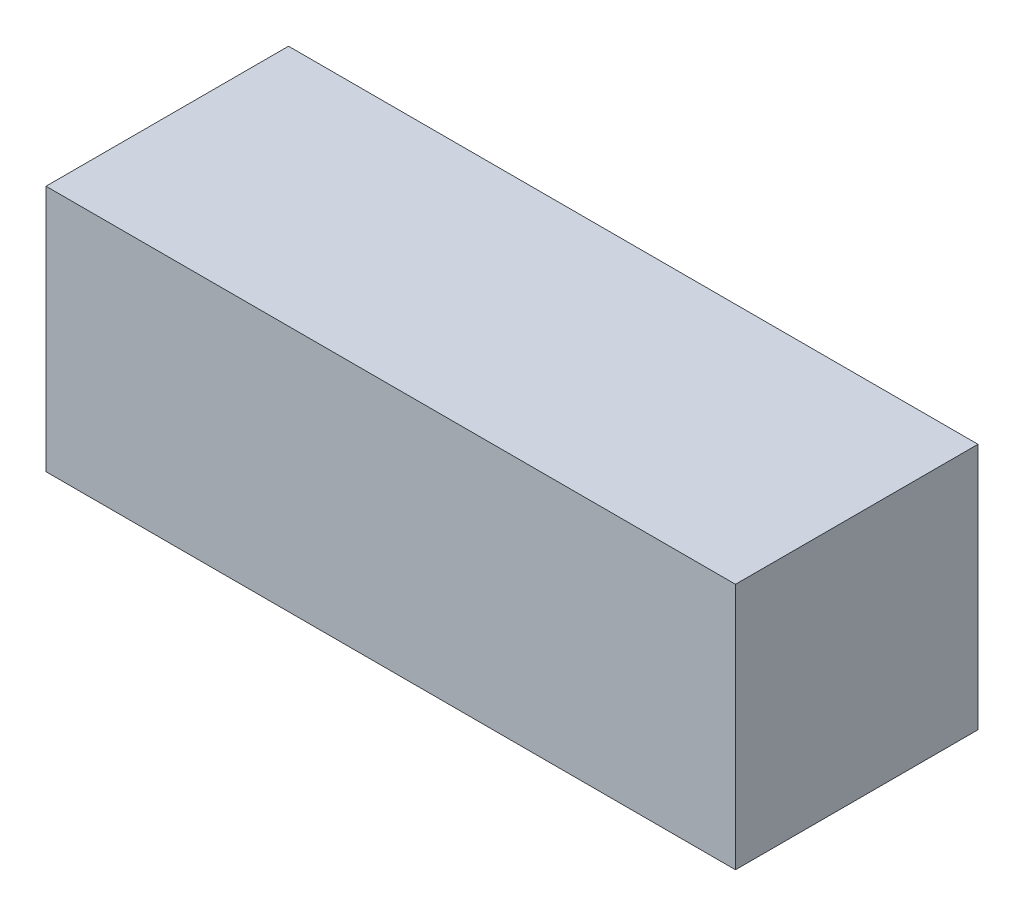
ISO-10303-21;
HEADER;
FILE_DESCRIPTION(('STEP AP214'),'2;1');
FILE_NAME('part.step','',(''),(''),'','','');
FILE_SCHEMA(('AUTOMOTIVE_DESIGN { 1 0 10303 214 1 1 1 1 }'));
ENDSEC;
DATA;
#1=APPLICATION_CONTEXT('core data for automotive mechanical design processes');
#2=APPLICATION_PROTOCOL_DEFINITION('international standard','automotive_design',2000,#1);
#3=PRODUCT_CONTEXT('',#1,'mechanical');
#4=PRODUCT('Part','Part','',(#3));
#5=PRODUCT_RELATED_PRODUCT_CATEGORY('part','',(#4));
#6=PRODUCT_DEFINITION_FORMATION('','',#4);
#7=PRODUCT_DEFINITION_CONTEXT('part definition',#1,'design');
#8=PRODUCT_DEFINITION('design','',#6,#7);
#9=PRODUCT_DEFINITION_SHAPE('','',#8);
#10=(LENGTH_UNIT() NAMED_UNIT(*) SI_UNIT(.MILLI.,.METRE.));
#11=(NAMED_UNIT(*) PLANE_ANGLE_UNIT() SI_UNIT($,.RADIAN.));
#12=(NAMED_UNIT(*) SI_UNIT($,.STERADIAN.) SOLID_ANGLE_UNIT());
#13=UNCERTAINTY_MEASURE_WITH_UNIT(LENGTH_MEASURE(1.E-05),#10,'distance_accuracy_value','');
#14=(GEOMETRIC_REPRESENTATION_CONTEXT(3) GLOBAL_UNCERTAINTY_ASSIGNED_CONTEXT((#13)) GLOBAL_UNIT_ASSIGNED_CONTEXT((#10,
#11,#12)) REPRESENTATION_CONTEXT('',''));
#15=CARTESIAN_POINT('',(0.,0.,0.));
#16=DIRECTION('',(0.,0.,1.));
#17=DIRECTION('',(1.,0.,0.));
#18=AXIS2_PLACEMENT_3D('',#15,#16,#17);
#19=CARTESIAN_POINT('',(72.499982,51.999896,-25.499949));
#20=DIRECTION('',(-1.,0.,0.));
#21=DIRECTION('',(0.,0.,1.));
#22=AXIS2_PLACEMENT_3D('',#19,#20,#21);
#23=PLANE('',#22);
#24=DIRECTION('',(0.,0.,-1.));
#25=VECTOR('',#24,1.);
#26=CARTESIAN_POINT('',(72.499982,0.,-25.499949));
#27=LINE('',#26,#25);
#28=CARTESIAN_POINT('',(72.499982,0.,25.499949));
#29=VERTEX_POINT('',#28);
#30=CARTESIAN_POINT('',(72.499982,0.,-25.499949));
#31=VERTEX_POINT('',#30);
#32=EDGE_CURVE('E99',#29,#31,#27,.T.);
#33=ORIENTED_EDGE('',*,*,#32,.T.);
#34=DIRECTION('',(0.,-1.,0.));
#35=VECTOR('',#34,1.);
#36=CARTESIAN_POINT('',(72.499982,51.999896,-25.499949));
#37=LINE('',#36,#35);
#38=CARTESIAN_POINT('',(72.499982,51.999896,-25.499949));
#39=VERTEX_POINT('',#38);
#40=EDGE_CURVE('E11',#39,#31,#37,.T.);
#41=ORIENTED_EDGE('',*,*,#40,.F.);
#42=DIRECTION('',(0.,0.,-1.));
#43=VECTOR('',#42,1.);
#44=CARTESIAN_POINT('',(72.499982,51.999896,-25.499949));
#45=LINE('',#44,#43);
#46=CARTESIAN_POINT('',(72.499982,51.999896,25.499949));
#47=VERTEX_POINT('',#46);
#48=EDGE_CURVE('E87',#47,#39,#45,.T.);
#49=ORIENTED_EDGE('',*,*,#48,.F.);
#50=DIRECTION('',(0.,-1.,0.));
#51=VECTOR('',#50,1.);
#52=CARTESIAN_POINT('',(72.499982,51.999896,25.499949));
#53=LINE('',#52,#51);
#54=EDGE_CURVE('E95',#47,#29,#53,.T.);
#55=ORIENTED_EDGE('',*,*,#54,.T.);
#56=EDGE_LOOP('',(#33,#41,#49,#55));
#57=FACE_BOUND('',#56,.T.);
#58=ADVANCED_FACE('F36',(#57),#23,.F.);
#59=CARTESIAN_POINT('',(-72.499982,51.999896,-25.499949));
#60=DIRECTION('',(0.,0.,1.));
#61=DIRECTION('',(1.,0.,0.));
#62=AXIS2_PLACEMENT_3D('',#59,#60,#61);
#63=PLANE('',#62);
#64=DIRECTION('',(-1.,0.,0.));
#65=VECTOR('',#64,1.);
#66=CARTESIAN_POINT('',(-72.499982,0.,-25.499949));
#67=LINE('',#66,#65);
#68=CARTESIAN_POINT('',(-72.499982,0.,-25.499949));
#69=VERTEX_POINT('',#68);
#70=EDGE_CURVE('E91',#31,#69,#67,.T.);
#71=ORIENTED_EDGE('',*,*,#70,.T.);
#72=DIRECTION('',(0.,-1.,0.));
#73=VECTOR('',#72,1.);
#74=CARTESIAN_POINT('',(-72.499982,51.999896,-25.499949));
#75=LINE('',#74,#73);
#76=CARTESIAN_POINT('',(-72.499982,51.999896,-25.499949));
#77=VERTEX_POINT('',#76);
#78=EDGE_CURVE('E44',#77,#69,#75,.T.);
#79=ORIENTED_EDGE('',*,*,#78,.F.);
#80=DIRECTION('',(-1.,0.,0.));
#81=VECTOR('',#80,1.);
#82=CARTESIAN_POINT('',(-72.499982,51.999896,-25.499949));
#83=LINE('',#82,#81);
#84=EDGE_CURVE('E82',#39,#77,#83,.T.);
#85=ORIENTED_EDGE('',*,*,#84,.F.);
#86=ORIENTED_EDGE('',*,*,#40,.T.);
#87=EDGE_LOOP('',(#71,#79,#85,#86));
#88=FACE_BOUND('',#87,.T.);
#89=ADVANCED_FACE('F90',(#88),#63,.F.);
#90=CARTESIAN_POINT('',(-72.499982,51.999896,-25.499949));
#91=DIRECTION('',(1.,0.,0.));
#92=DIRECTION('',(0.,0.,-1.));
#93=AXIS2_PLACEMENT_3D('',#90,#91,#92);
#94=PLANE('',#93);
#95=DIRECTION('',(0.,0.,1.));
#96=VECTOR('',#95,1.);
#97=CARTESIAN_POINT('',(-72.499982,0.,-25.499949));
#98=LINE('',#97,#96);
#99=CARTESIAN_POINT('',(-72.499982,0.,25.499949));
#100=VERTEX_POINT('',#99);
#101=EDGE_CURVE('E69',#69,#100,#98,.T.);
#102=ORIENTED_EDGE('',*,*,#101,.T.);
#103=DIRECTION('',(0.,-1.,0.));
#104=VECTOR('',#103,1.);
#105=CARTESIAN_POINT('',(-72.499982,51.999896,25.499949));
#106=LINE('',#105,#104);
#107=CARTESIAN_POINT('',(-72.499982,51.999896,25.499949));
#108=VERTEX_POINT('',#107);
#109=EDGE_CURVE('E92',#108,#100,#106,.T.);
#110=ORIENTED_EDGE('',*,*,#109,.F.);
#111=DIRECTION('',(0.,0.,1.));
#112=VECTOR('',#111,1.);
#113=CARTESIAN_POINT('',(-72.499982,51.999896,-25.499949));
#114=LINE('',#113,#112);
#115=EDGE_CURVE('E85',#77,#108,#114,.T.);
#116=ORIENTED_EDGE('',*,*,#115,.F.);
#117=ORIENTED_EDGE('',*,*,#78,.T.);
#118=EDGE_LOOP('',(#102,#110,#116,#117));
#119=FACE_BOUND('',#118,.T.);
#120=ADVANCED_FACE('F93',(#119),#94,.F.);
#121=CARTESIAN_POINT('',(-72.499982,51.999896,25.499949));
#122=DIRECTION('',(0.,0.,-1.));
#123=DIRECTION('',(-1.,0.,0.));
#124=AXIS2_PLACEMENT_3D('',#121,#122,#123);
#125=PLANE('',#124);
#126=DIRECTION('',(1.,0.,0.));
#127=VECTOR('',#126,1.);
#128=CARTESIAN_POINT('',(-72.499982,0.,25.499949));
#129=LINE('',#128,#127);
#130=EDGE_CURVE('E75',#100,#29,#129,.T.);
#131=ORIENTED_EDGE('',*,*,#130,.T.);
#132=ORIENTED_EDGE('',*,*,#54,.F.);
#133=DIRECTION('',(1.,0.,0.));
#134=VECTOR('',#133,1.);
#135=CARTESIAN_POINT('',(-72.499982,51.999896,25.499949));
#136=LINE('',#135,#134);
#137=EDGE_CURVE('E52',#108,#47,#136,.T.);
#138=ORIENTED_EDGE('',*,*,#137,.F.);
#139=ORIENTED_EDGE('',*,*,#109,.T.);
#140=EDGE_LOOP('',(#131,#132,#138,#139));
#141=FACE_BOUND('',#140,.T.);
#142=ADVANCED_FACE('F106',(#141),#125,.F.);
#143=CARTESIAN_POINT('',(0.,51.999896,0.));
#144=DIRECTION('',(0.,1.,0.));
#145=DIRECTION('',(0.,0.,1.));
#146=AXIS2_PLACEMENT_3D('',#143,#144,#145);
#147=PLANE('',#146);
#148=ORIENTED_EDGE('',*,*,#48,.T.);
#149=ORIENTED_EDGE('',*,*,#84,.T.);
#150=ORIENTED_EDGE('',*,*,#115,.T.);
#151=ORIENTED_EDGE('',*,*,#137,.T.);
#152=EDGE_LOOP('',(#148,#149,#150,#151));
#153=FACE_BOUND('',#152,.T.);
#154=ADVANCED_FACE('F83',(#153),#147,.T.);
#155=CARTESIAN_POINT('',(0.,0.,0.));
#156=DIRECTION('',(0.,1.,0.));
#157=DIRECTION('',(0.,0.,1.));
#158=AXIS2_PLACEMENT_3D('',#155,#156,#157);
#159=PLANE('',#158);
#160=ORIENTED_EDGE('',*,*,#32,.F.);
#161=ORIENTED_EDGE('',*,*,#130,.F.);
#162=ORIENTED_EDGE('',*,*,#101,.F.);
#163=ORIENTED_EDGE('',*,*,#70,.F.);
#164=EDGE_LOOP('',(#160,#161,#162,#163));
#165=FACE_BOUND('',#164,.T.);
#166=ADVANCED_FACE('F109',(#165),#159,.F.);
#167=CLOSED_SHELL('',(#58,#89,#120,#142,#154,#166));
#168=MANIFOLD_SOLID_BREP('B2',#167);
#169=ADVANCED_BREP_SHAPE_REPRESENTATION('',(#18,#168),#14);
#170=SHAPE_DEFINITION_REPRESENTATION(#9,#169);
ENDSEC;
END-ISO-10303-21;
